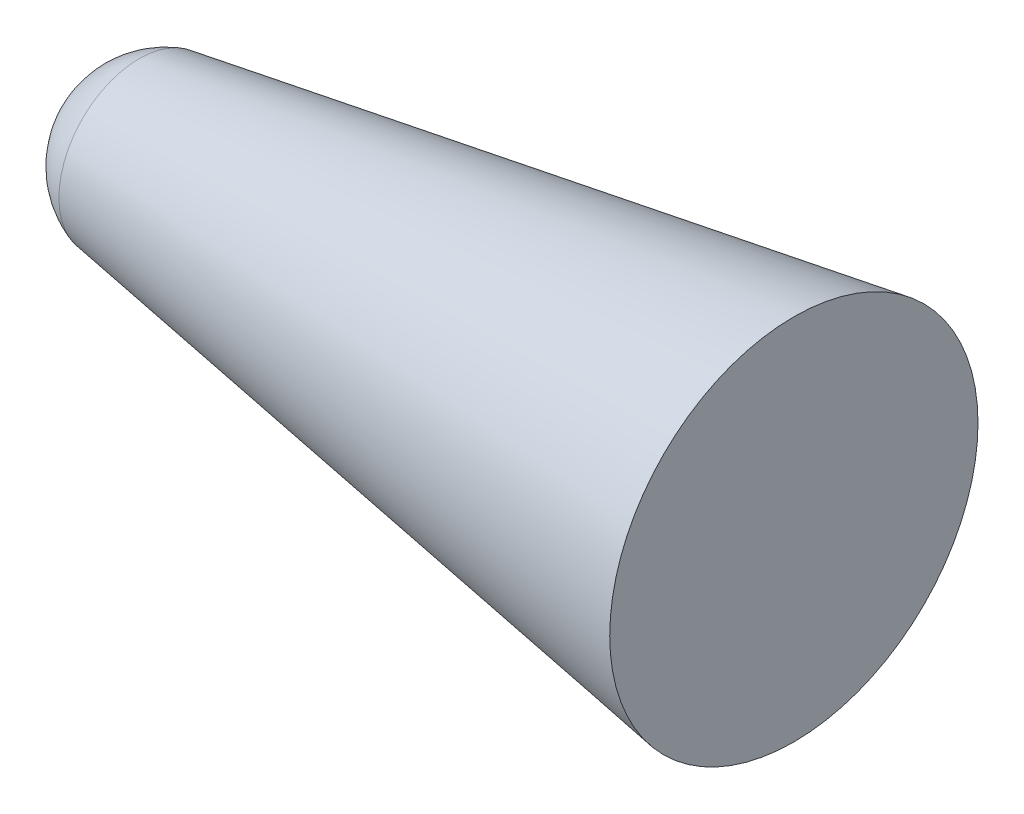
ISO-10303-21;
HEADER;
FILE_DESCRIPTION(('STEP AP214'),'2;1');
FILE_NAME('part.step','',(''),(''),'','','');
FILE_SCHEMA(('AUTOMOTIVE_DESIGN { 1 0 10303 214 1 1 1 1 }'));
ENDSEC;
DATA;
#1=APPLICATION_CONTEXT('core data for automotive mechanical design processes');
#2=APPLICATION_PROTOCOL_DEFINITION('international standard','automotive_design',2000,#1);
#3=PRODUCT_CONTEXT('',#1,'mechanical');
#4=PRODUCT('Part','Part','',(#3));
#5=PRODUCT_RELATED_PRODUCT_CATEGORY('part','',(#4));
#6=PRODUCT_DEFINITION_FORMATION('','',#4);
#7=PRODUCT_DEFINITION_CONTEXT('part definition',#1,'design');
#8=PRODUCT_DEFINITION('design','',#6,#7);
#9=PRODUCT_DEFINITION_SHAPE('','',#8);
#10=(LENGTH_UNIT() NAMED_UNIT(*) SI_UNIT(.MILLI.,.METRE.));
#11=(NAMED_UNIT(*) PLANE_ANGLE_UNIT() SI_UNIT($,.RADIAN.));
#12=(NAMED_UNIT(*) SI_UNIT($,.STERADIAN.) SOLID_ANGLE_UNIT());
#13=UNCERTAINTY_MEASURE_WITH_UNIT(LENGTH_MEASURE(1.E-05),#10,'distance_accuracy_value','');
#14=(GEOMETRIC_REPRESENTATION_CONTEXT(3) GLOBAL_UNCERTAINTY_ASSIGNED_CONTEXT((#13)) GLOBAL_UNIT_ASSIGNED_CONTEXT((#10,
#11,#12)) REPRESENTATION_CONTEXT('',''));
#15=CARTESIAN_POINT('',(0.,0.,0.));
#16=DIRECTION('',(0.,0.,1.));
#17=DIRECTION('',(1.,0.,0.));
#18=AXIS2_PLACEMENT_3D('',#15,#16,#17);
#19=CARTESIAN_POINT('',(172.719391479287,0.,0.));
#20=DIRECTION('',(-1.,0.,0.));
#21=DIRECTION('',(0.,1.,0.));
#22=AXIS2_PLACEMENT_3D('',#19,#20,#21);
#23=SPHERICAL_SURFACE('',#22,152.5);
#24=CARTESIAN_POINT('',(125.59429983711,0.,0.));
#25=DIRECTION('',(-1.,0.,0.));
#26=DIRECTION('',(0.,0.,1.));
#27=AXIS2_PLACEMENT_3D('',#24,#25,#26);
#28=CIRCLE('',#27,145.036118735012);
#29=CARTESIAN_POINT('',(125.59429983711,0.,145.036118735012));
#30=VERTEX_POINT('',#29);
#31=EDGE_CURVE('E39',#30,#30,#28,.T.);
#32=ORIENTED_EDGE('',*,*,#31,.T.);
#33=EDGE_LOOP('',(#32));
#34=FACE_BOUND('',#33,.T.);
#35=ADVANCED_FACE('F33',(#34),#23,.T.);
#36=CARTESIAN_POINT('',(1305.21939147929,0.,0.));
#37=DIRECTION('',(-1.,0.,0.));
#38=DIRECTION('',(0.,0.,1.));
#39=AXIS2_PLACEMENT_3D('',#36,#37,#38);
#40=PLANE('',#39);
#41=CARTESIAN_POINT('',(1305.21939147929,0.,0.));
#42=DIRECTION('',(-1.,0.,0.));
#43=DIRECTION('',(0.,0.,1.));
#44=AXIS2_PLACEMENT_3D('',#41,#42,#43);
#45=CIRCLE('',#44,331.870378667538);
#46=CARTESIAN_POINT('',(1305.21939147929,0.,331.870378667538));
#47=VERTEX_POINT('',#46);
#48=EDGE_CURVE('E10',#47,#47,#45,.T.);
#49=ORIENTED_EDGE('',*,*,#48,.F.);
#50=EDGE_LOOP('',(#49));
#51=FACE_BOUND('',#50,.T.);
#52=ADVANCED_FACE('F48',(#51),#40,.F.);
#53=CARTESIAN_POINT('',(125.59429983711,0.,0.));
#54=DIRECTION('',(1.,0.,0.));
#55=DIRECTION('',(0.,0.,-1.));
#56=AXIS2_PLACEMENT_3D('',#53,#54,#55);
#57=CONICAL_SURFACE('',#56,145.036118735012,0.15707963267949);
#58=ORIENTED_EDGE('',*,*,#48,.T.);
#59=EDGE_LOOP('',(#58));
#60=FACE_BOUND('',#59,.T.);
#61=ORIENTED_EDGE('',*,*,#31,.F.);
#62=EDGE_LOOP('',(#61));
#63=FACE_BOUND('',#62,.T.);
#64=ADVANCED_FACE('F46',(#60,#63),#57,.T.);
#65=CLOSED_SHELL('',(#35,#52,#64));
#66=MANIFOLD_SOLID_BREP('B2',#65);
#67=ADVANCED_BREP_SHAPE_REPRESENTATION('',(#18,#66),#14);
#68=SHAPE_DEFINITION_REPRESENTATION(#9,#67);
ENDSEC;
END-ISO-10303-21;
